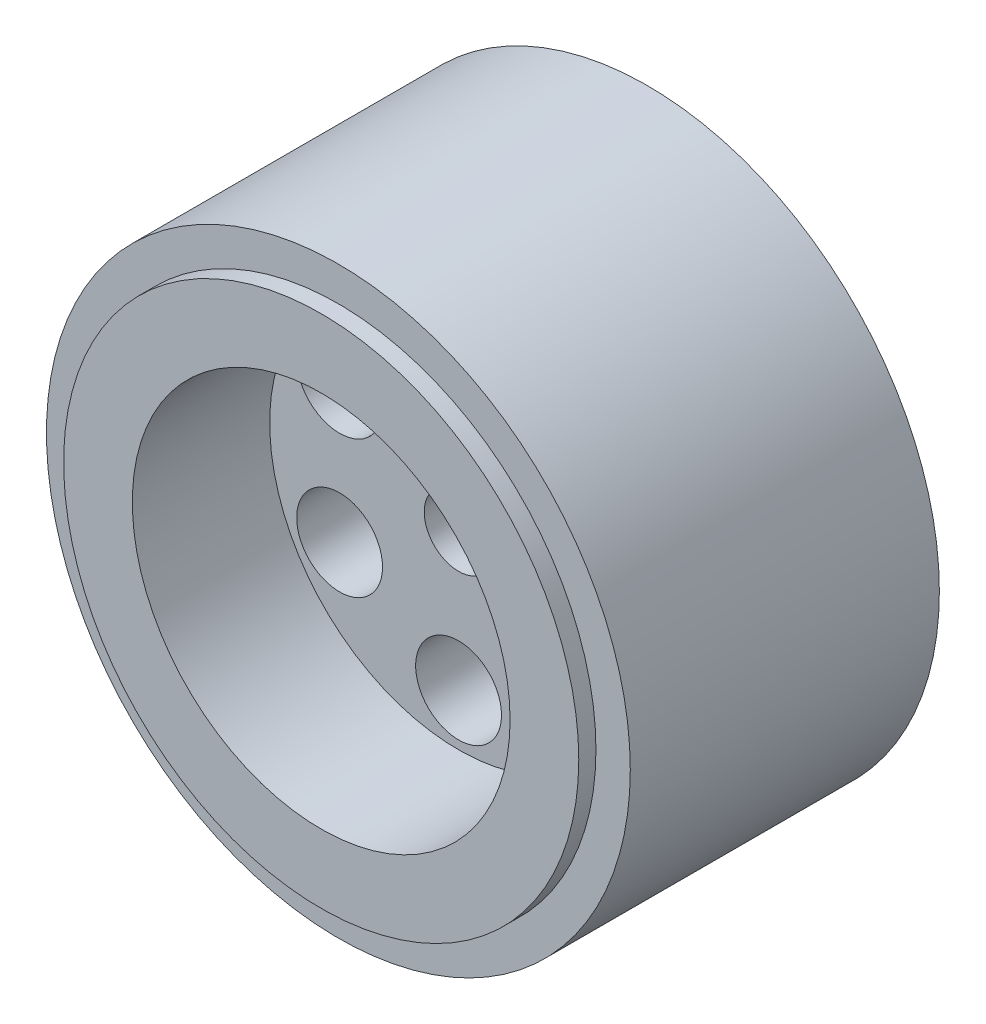
ISO-10303-21;
HEADER;
FILE_DESCRIPTION(('STEP AP214'),'2;1');
FILE_NAME('part.step','',(''),(''),'','','');
FILE_SCHEMA(('AUTOMOTIVE_DESIGN { 1 0 10303 214 1 1 1 1 }'));
ENDSEC;
DATA;
#1=APPLICATION_CONTEXT('core data for automotive mechanical design processes');
#2=APPLICATION_PROTOCOL_DEFINITION('international standard','automotive_design',2000,#1);
#3=PRODUCT_CONTEXT('',#1,'mechanical');
#4=PRODUCT('Part','Part','',(#3));
#5=PRODUCT_RELATED_PRODUCT_CATEGORY('part','',(#4));
#6=PRODUCT_DEFINITION_FORMATION('','',#4);
#7=PRODUCT_DEFINITION_CONTEXT('part definition',#1,'design');
#8=PRODUCT_DEFINITION('design','',#6,#7);
#9=PRODUCT_DEFINITION_SHAPE('','',#8);
#10=(LENGTH_UNIT() NAMED_UNIT(*) SI_UNIT(.MILLI.,.METRE.));
#11=(NAMED_UNIT(*) PLANE_ANGLE_UNIT() SI_UNIT($,.RADIAN.));
#12=(NAMED_UNIT(*) SI_UNIT($,.STERADIAN.) SOLID_ANGLE_UNIT());
#13=UNCERTAINTY_MEASURE_WITH_UNIT(LENGTH_MEASURE(1.E-05),#10,'distance_accuracy_value','');
#14=(GEOMETRIC_REPRESENTATION_CONTEXT(3) GLOBAL_UNCERTAINTY_ASSIGNED_CONTEXT((#13)) GLOBAL_UNIT_ASSIGNED_CONTEXT((#10,
#11,#12)) REPRESENTATION_CONTEXT('',''));
#15=CARTESIAN_POINT('',(0.,0.,0.));
#16=DIRECTION('',(0.,0.,1.));
#17=DIRECTION('',(1.,0.,0.));
#18=AXIS2_PLACEMENT_3D('',#15,#16,#17);
#19=CARTESIAN_POINT('',(0.,28.001,-21.999));
#20=DIRECTION('',(0.,0.,1.));
#21=DIRECTION('',(1.,0.,0.));
#22=AXIS2_PLACEMENT_3D('',#19,#20,#21);
#23=PLANE('',#22);
#24=CARTESIAN_POINT('',(0.,0.,-21.999));
#25=DIRECTION('',(0.,0.,1.));
#26=DIRECTION('',(1.,0.,0.));
#27=AXIS2_PLACEMENT_3D('',#24,#25,#26);
#28=CIRCLE('',#27,34.001);
#29=CARTESIAN_POINT('',(34.001,0.,-21.999));
#30=VERTEX_POINT('',#29);
#31=EDGE_CURVE('E11',#30,#30,#28,.T.);
#32=ORIENTED_EDGE('',*,*,#31,.F.);
#33=EDGE_LOOP('',(#32));
#34=FACE_BOUND('',#33,.T.);
#35=CARTESIAN_POINT('',(0.,0.,-21.999));
#36=DIRECTION('',(0.,0.,1.));
#37=DIRECTION('',(1.,0.,0.));
#38=AXIS2_PLACEMENT_3D('',#35,#36,#37);
#39=CIRCLE('',#38,28.001);
#40=CARTESIAN_POINT('',(28.001,0.,-21.999));
#41=VERTEX_POINT('',#40);
#42=EDGE_CURVE('E55',#41,#41,#39,.T.);
#43=ORIENTED_EDGE('',*,*,#42,.T.);
#44=EDGE_LOOP('',(#43));
#45=FACE_BOUND('',#44,.T.);
#46=ADVANCED_FACE('F41',(#34,#45),#23,.F.);
#47=CARTESIAN_POINT('',(0.,0.,0.));
#48=DIRECTION('',(0.,0.,1.));
#49=DIRECTION('',(1.,0.,0.));
#50=AXIS2_PLACEMENT_3D('',#47,#48,#49);
#51=CYLINDRICAL_SURFACE('',#50,34.001);
#52=CARTESIAN_POINT('',(0.,0.,13.999));
#53=DIRECTION('',(0.,0.,1.));
#54=DIRECTION('',(1.,0.,0.));
#55=AXIS2_PLACEMENT_3D('',#52,#53,#54);
#56=CIRCLE('',#55,34.001);
#57=CARTESIAN_POINT('',(34.001,0.,13.999));
#58=VERTEX_POINT('',#57);
#59=EDGE_CURVE('E47',#58,#58,#56,.T.);
#60=ORIENTED_EDGE('',*,*,#59,.F.);
#61=EDGE_LOOP('',(#60));
#62=FACE_BOUND('',#61,.T.);
#63=ORIENTED_EDGE('',*,*,#31,.T.);
#64=EDGE_LOOP('',(#63));
#65=FACE_BOUND('',#64,.T.);
#66=ADVANCED_FACE('F70',(#62,#65),#51,.T.);
#67=CARTESIAN_POINT('',(0.,34.001,13.999));
#68=DIRECTION('',(0.,0.,-1.));
#69=DIRECTION('',(-1.,0.,0.));
#70=AXIS2_PLACEMENT_3D('',#67,#68,#69);
#71=PLANE('',#70);
#72=CARTESIAN_POINT('',(0.,0.,13.999));
#73=DIRECTION('',(0.,0.,1.));
#74=DIRECTION('',(1.,0.,0.));
#75=AXIS2_PLACEMENT_3D('',#72,#73,#74);
#76=CIRCLE('',#75,28.001);
#77=CARTESIAN_POINT('',(28.001,0.,13.999));
#78=VERTEX_POINT('',#77);
#79=EDGE_CURVE('E51',#78,#78,#76,.T.);
#80=ORIENTED_EDGE('',*,*,#79,.F.);
#81=EDGE_LOOP('',(#80));
#82=FACE_BOUND('',#81,.T.);
#83=ORIENTED_EDGE('',*,*,#59,.T.);
#84=EDGE_LOOP('',(#83));
#85=FACE_BOUND('',#84,.T.);
#86=ADVANCED_FACE('F65',(#82,#85),#71,.F.);
#87=CARTESIAN_POINT('',(0.,0.,0.));
#88=DIRECTION('',(0.,0.,1.));
#89=DIRECTION('',(1.,0.,0.));
#90=AXIS2_PLACEMENT_3D('',#87,#88,#89);
#91=CYLINDRICAL_SURFACE('',#90,28.001);
#92=ORIENTED_EDGE('',*,*,#42,.F.);
#93=EDGE_LOOP('',(#92));
#94=FACE_BOUND('',#93,.T.);
#95=ORIENTED_EDGE('',*,*,#79,.T.);
#96=EDGE_LOOP('',(#95));
#97=FACE_BOUND('',#96,.T.);
#98=ADVANCED_FACE('F62',(#94,#97),#91,.F.);
#99=CLOSED_SHELL('',(#46,#66,#86,#98));
#100=MANIFOLD_SOLID_BREP('B2',#99);
#101=CARTESIAN_POINT('',(0.,22.,-8.));
#102=DIRECTION('',(0.,0.,1.));
#103=DIRECTION('',(1.,0.,0.));
#104=AXIS2_PLACEMENT_3D('',#101,#102,#103);
#105=PLANE('',#104);
#106=CARTESIAN_POINT('',(13.8564064605514,8.00000000000074,-8.));
#107=DIRECTION('',(0.,0.,1.));
#108=DIRECTION('',(1.,0.,0.));
#109=AXIS2_PLACEMENT_3D('',#106,#107,#108);
#110=CIRCLE('',#109,5.);
#111=CARTESIAN_POINT('',(18.8564064605514,8.00000000000074,-8.));
#112=VERTEX_POINT('',#111);
#113=EDGE_CURVE('E153',#112,#112,#110,.F.);
#114=ORIENTED_EDGE('',*,*,#113,.F.);
#115=EDGE_LOOP('',(#114));
#116=FACE_BOUND('',#115,.T.);
#117=CARTESIAN_POINT('',(13.8564064605523,-7.99999999999926,-8.));
#118=DIRECTION('',(0.,0.,1.));
#119=DIRECTION('',(1.,0.,0.));
#120=AXIS2_PLACEMENT_3D('',#117,#118,#119);
#121=CIRCLE('',#120,5.);
#122=CARTESIAN_POINT('',(18.8564064605523,-7.99999999999926,-8.));
#123=VERTEX_POINT('',#122);
#124=EDGE_CURVE('E168',#123,#123,#121,.F.);
#125=ORIENTED_EDGE('',*,*,#124,.F.);
#126=EDGE_LOOP('',(#125));
#127=FACE_BOUND('',#126,.T.);
#128=CARTESIAN_POINT('',(1.70169907897954E-12,-16.,-8.));
#129=DIRECTION('',(0.,0.,1.));
#130=DIRECTION('',(1.,0.,0.));
#131=AXIS2_PLACEMENT_3D('',#128,#129,#130);
#132=CIRCLE('',#131,5.);
#133=CARTESIAN_POINT('',(5.0000000000017,-16.,-8.));
#134=VERTEX_POINT('',#133);
#135=EDGE_CURVE('E162',#134,#134,#132,.F.);
#136=ORIENTED_EDGE('',*,*,#135,.F.);
#137=EDGE_LOOP('',(#136));
#138=FACE_BOUND('',#137,.T.);
#139=CARTESIAN_POINT('',(-13.8564064605506,7.99999999999925,-8.));
#140=DIRECTION('',(0.,0.,1.));
#141=DIRECTION('',(1.,0.,0.));
#142=AXIS2_PLACEMENT_3D('',#139,#140,#141);
#143=CIRCLE('',#142,5.);
#144=CARTESIAN_POINT('',(-8.8564064605506,7.99999999999925,-8.));
#145=VERTEX_POINT('',#144);
#146=EDGE_CURVE('E161',#145,#145,#143,.F.);
#147=ORIENTED_EDGE('',*,*,#146,.F.);
#148=EDGE_LOOP('',(#147));
#149=FACE_BOUND('',#148,.T.);
#150=CARTESIAN_POINT('',(0.,16.,-8.));
#151=DIRECTION('',(0.,0.,1.));
#152=DIRECTION('',(1.,0.,0.));
#153=AXIS2_PLACEMENT_3D('',#150,#151,#152);
#154=CIRCLE('',#153,5.);
#155=CARTESIAN_POINT('',(5.,16.,-8.));
#156=VERTEX_POINT('',#155);
#157=EDGE_CURVE('E147',#156,#156,#154,.F.);
#158=ORIENTED_EDGE('',*,*,#157,.F.);
#159=EDGE_LOOP('',(#158));
#160=FACE_BOUND('',#159,.T.);
#161=CARTESIAN_POINT('',(0.,0.,-8.));
#162=DIRECTION('',(0.,0.,1.));
#163=DIRECTION('',(1.,0.,0.));
#164=AXIS2_PLACEMENT_3D('',#161,#162,#163);
#165=CIRCLE('',#164,22.);
#166=CARTESIAN_POINT('',(22.,0.,-8.));
#167=VERTEX_POINT('',#166);
#168=EDGE_CURVE('E126',#167,#167,#165,.T.);
#169=ORIENTED_EDGE('',*,*,#168,.F.);
#170=EDGE_LOOP('',(#169));
#171=FACE_BOUND('',#170,.T.);
#172=CARTESIAN_POINT('',(0.,0.,-8.));
#173=DIRECTION('',(0.,0.,1.));
#174=DIRECTION('',(1.,0.,0.));
#175=AXIS2_PLACEMENT_3D('',#172,#173,#174);
#176=CIRCLE('',#175,10.);
#177=CARTESIAN_POINT('',(10.,0.,-8.));
#178=VERTEX_POINT('',#177);
#179=EDGE_CURVE('E123',#178,#178,#176,.T.);
#180=ORIENTED_EDGE('',*,*,#179,.T.);
#181=EDGE_LOOP('',(#180));
#182=FACE_BOUND('',#181,.T.);
#183=CARTESIAN_POINT('',(-13.8564064605497,-8.00000000000074,-8.));
#184=DIRECTION('',(0.,0.,1.));
#185=DIRECTION('',(1.,0.,0.));
#186=AXIS2_PLACEMENT_3D('',#183,#184,#185);
#187=CIRCLE('',#186,5.);
#188=CARTESIAN_POINT('',(-8.85640646054974,-8.00000000000074,-8.));
#189=VERTEX_POINT('',#188);
#190=EDGE_CURVE('E154',#189,#189,#187,.F.);
#191=ORIENTED_EDGE('',*,*,#190,.F.);
#192=EDGE_LOOP('',(#191));
#193=FACE_BOUND('',#192,.T.);
#194=ADVANCED_FACE('F103',(#116,#127,#138,#149,#160,#171,#182,#193),#105,.F.);
#195=CARTESIAN_POINT('',(0.,0.,0.));
#196=DIRECTION('',(0.,0.,1.));
#197=DIRECTION('',(1.,0.,0.));
#198=AXIS2_PLACEMENT_3D('',#195,#196,#197);
#199=CYLINDRICAL_SURFACE('',#198,22.);
#200=CARTESIAN_POINT('',(0.,0.,0.));
#201=DIRECTION('',(0.,0.,1.));
#202=DIRECTION('',(1.,0.,0.));
#203=AXIS2_PLACEMENT_3D('',#200,#201,#202);
#204=CIRCLE('',#203,22.);
#205=CARTESIAN_POINT('',(22.,0.,0.));
#206=VERTEX_POINT('',#205);
#207=EDGE_CURVE('E40',#206,#206,#204,.T.);
#208=ORIENTED_EDGE('',*,*,#207,.F.);
#209=EDGE_LOOP('',(#208));
#210=FACE_BOUND('',#209,.T.);
#211=CARTESIAN_POINT('',(0.,0.,16.));
#212=DIRECTION('',(0.,0.,1.));
#213=DIRECTION('',(1.,0.,0.));
#214=AXIS2_PLACEMENT_3D('',#211,#212,#213);
#215=CIRCLE('',#214,22.);
#216=CARTESIAN_POINT('',(22.,0.,16.));
#217=VERTEX_POINT('',#216);
#218=EDGE_CURVE('E144',#217,#217,#215,.T.);
#219=ORIENTED_EDGE('',*,*,#218,.T.);
#220=EDGE_LOOP('',(#219));
#221=FACE_BOUND('',#220,.T.);
#222=ADVANCED_FACE('F105',(#210,#221),#199,.F.);
#223=CARTESIAN_POINT('',(0.,4.,0.));
#224=DIRECTION('',(0.,0.,-1.));
#225=DIRECTION('',(-1.,0.,0.));
#226=AXIS2_PLACEMENT_3D('',#223,#224,#225);
#227=PLANE('',#226);
#228=CARTESIAN_POINT('',(13.8564064605514,8.00000000000074,0.));
#229=DIRECTION('',(0.,0.,1.));
#230=DIRECTION('',(1.,0.,0.));
#231=AXIS2_PLACEMENT_3D('',#228,#229,#230);
#232=CIRCLE('',#231,5.);
#233=CARTESIAN_POINT('',(18.8564064605514,8.00000000000074,0.));
#234=VERTEX_POINT('',#233);
#235=EDGE_CURVE('E171',#234,#234,#232,.T.);
#236=ORIENTED_EDGE('',*,*,#235,.F.);
#237=EDGE_LOOP('',(#236));
#238=FACE_BOUND('',#237,.T.);
#239=CARTESIAN_POINT('',(13.8564064605523,-7.99999999999926,0.));
#240=DIRECTION('',(0.,0.,1.));
#241=DIRECTION('',(1.,0.,0.));
#242=AXIS2_PLACEMENT_3D('',#239,#240,#241);
#243=CIRCLE('',#242,5.);
#244=CARTESIAN_POINT('',(18.8564064605523,-7.99999999999926,0.));
#245=VERTEX_POINT('',#244);
#246=EDGE_CURVE('E165',#245,#245,#243,.T.);
#247=ORIENTED_EDGE('',*,*,#246,.F.);
#248=EDGE_LOOP('',(#247));
#249=FACE_BOUND('',#248,.T.);
#250=CARTESIAN_POINT('',(1.70169907897954E-12,-16.,0.));
#251=DIRECTION('',(0.,0.,1.));
#252=DIRECTION('',(1.,0.,0.));
#253=AXIS2_PLACEMENT_3D('',#250,#251,#252);
#254=CIRCLE('',#253,5.);
#255=CARTESIAN_POINT('',(5.0000000000017,-16.,0.));
#256=VERTEX_POINT('',#255);
#257=EDGE_CURVE('E157',#256,#256,#254,.T.);
#258=ORIENTED_EDGE('',*,*,#257,.F.);
#259=EDGE_LOOP('',(#258));
#260=FACE_BOUND('',#259,.T.);
#261=CARTESIAN_POINT('',(-13.8564064605497,-8.00000000000074,0.));
#262=DIRECTION('',(0.,0.,1.));
#263=DIRECTION('',(1.,0.,0.));
#264=AXIS2_PLACEMENT_3D('',#261,#262,#263);
#265=CIRCLE('',#264,5.);
#266=CARTESIAN_POINT('',(-8.85640646054974,-8.00000000000074,0.));
#267=VERTEX_POINT('',#266);
#268=EDGE_CURVE('E158',#267,#267,#265,.T.);
#269=ORIENTED_EDGE('',*,*,#268,.F.);
#270=EDGE_LOOP('',(#269));
#271=FACE_BOUND('',#270,.T.);
#272=CARTESIAN_POINT('',(-13.8564064605506,7.99999999999925,0.));
#273=DIRECTION('',(0.,0.,1.));
#274=DIRECTION('',(1.,0.,0.));
#275=AXIS2_PLACEMENT_3D('',#272,#273,#274);
#276=CIRCLE('',#275,5.);
#277=CARTESIAN_POINT('',(-8.8564064605506,7.99999999999925,0.));
#278=VERTEX_POINT('',#277);
#279=EDGE_CURVE('E180',#278,#278,#276,.T.);
#280=ORIENTED_EDGE('',*,*,#279,.F.);
#281=EDGE_LOOP('',(#280));
#282=FACE_BOUND('',#281,.T.);
#283=CARTESIAN_POINT('',(0.,16.,0.));
#284=DIRECTION('',(0.,0.,1.));
#285=DIRECTION('',(1.,0.,0.));
#286=AXIS2_PLACEMENT_3D('',#283,#284,#285);
#287=CIRCLE('',#286,5.);
#288=CARTESIAN_POINT('',(5.,16.,0.));
#289=VERTEX_POINT('',#288);
#290=EDGE_CURVE('E150',#289,#289,#287,.T.);
#291=ORIENTED_EDGE('',*,*,#290,.F.);
#292=EDGE_LOOP('',(#291));
#293=FACE_BOUND('',#292,.T.);
#294=CARTESIAN_POINT('',(0.,0.,0.));
#295=DIRECTION('',(0.,0.,1.));
#296=DIRECTION('',(1.,0.,0.));
#297=AXIS2_PLACEMENT_3D('',#294,#295,#296);
#298=CIRCLE('',#297,4.);
#299=CARTESIAN_POINT('',(4.,0.,0.));
#300=VERTEX_POINT('',#299);
#301=EDGE_CURVE('E110',#300,#300,#298,.T.);
#302=ORIENTED_EDGE('',*,*,#301,.F.);
#303=EDGE_LOOP('',(#302));
#304=FACE_BOUND('',#303,.T.);
#305=ORIENTED_EDGE('',*,*,#207,.T.);
#306=EDGE_LOOP('',(#305));
#307=FACE_BOUND('',#306,.T.);
#308=ADVANCED_FACE('F186',(#238,#249,#260,#271,#282,#293,#304,#307),#227,.F.);
#309=CARTESIAN_POINT('',(0.,0.,0.));
#310=DIRECTION('',(0.,0.,1.));
#311=DIRECTION('',(1.,0.,0.));
#312=AXIS2_PLACEMENT_3D('',#309,#310,#311);
#313=CYLINDRICAL_SURFACE('',#312,4.);
#314=CARTESIAN_POINT('',(0.,0.,-22.));
#315=DIRECTION('',(0.,0.,1.));
#316=DIRECTION('',(1.,0.,0.));
#317=AXIS2_PLACEMENT_3D('',#314,#315,#316);
#318=CIRCLE('',#317,4.);
#319=CARTESIAN_POINT('',(4.,0.,-22.));
#320=VERTEX_POINT('',#319);
#321=EDGE_CURVE('E114',#320,#320,#318,.T.);
#322=ORIENTED_EDGE('',*,*,#321,.F.);
#323=EDGE_LOOP('',(#322));
#324=FACE_BOUND('',#323,.T.);
#325=ORIENTED_EDGE('',*,*,#301,.T.);
#326=EDGE_LOOP('',(#325));
#327=FACE_BOUND('',#326,.T.);
#328=ADVANCED_FACE('F189',(#324,#327),#313,.F.);
#329=CARTESIAN_POINT('',(0.,10.,-22.));
#330=DIRECTION('',(0.,0.,1.));
#331=DIRECTION('',(1.,0.,0.));
#332=AXIS2_PLACEMENT_3D('',#329,#330,#331);
#333=PLANE('',#332);
#334=CARTESIAN_POINT('',(0.,0.,-22.));
#335=DIRECTION('',(0.,0.,1.));
#336=DIRECTION('',(1.,0.,0.));
#337=AXIS2_PLACEMENT_3D('',#334,#335,#336);
#338=CIRCLE('',#337,10.);
#339=CARTESIAN_POINT('',(10.,0.,-22.));
#340=VERTEX_POINT('',#339);
#341=EDGE_CURVE('E118',#340,#340,#338,.T.);
#342=ORIENTED_EDGE('',*,*,#341,.F.);
#343=EDGE_LOOP('',(#342));
#344=FACE_BOUND('',#343,.T.);
#345=ORIENTED_EDGE('',*,*,#321,.T.);
#346=EDGE_LOOP('',(#345));
#347=FACE_BOUND('',#346,.T.);
#348=ADVANCED_FACE('F226',(#344,#347),#333,.F.);
#349=CARTESIAN_POINT('',(0.,0.,0.));
#350=DIRECTION('',(0.,0.,1.));
#351=DIRECTION('',(1.,0.,0.));
#352=AXIS2_PLACEMENT_3D('',#349,#350,#351);
#353=CYLINDRICAL_SURFACE('',#352,10.);
#354=ORIENTED_EDGE('',*,*,#179,.F.);
#355=EDGE_LOOP('',(#354));
#356=FACE_BOUND('',#355,.T.);
#357=ORIENTED_EDGE('',*,*,#341,.T.);
#358=EDGE_LOOP('',(#357));
#359=FACE_BOUND('',#358,.T.);
#360=ADVANCED_FACE('F223',(#356,#359),#353,.T.);
#361=CARTESIAN_POINT('',(0.,0.,0.));
#362=DIRECTION('',(0.,0.,1.));
#363=DIRECTION('',(1.,0.,0.));
#364=AXIS2_PLACEMENT_3D('',#361,#362,#363);
#365=CYLINDRICAL_SURFACE('',#364,22.);
#366=CARTESIAN_POINT('',(0.,0.,-22.));
#367=DIRECTION('',(0.,0.,1.));
#368=DIRECTION('',(1.,0.,0.));
#369=AXIS2_PLACEMENT_3D('',#366,#367,#368);
#370=CIRCLE('',#369,22.);
#371=CARTESIAN_POINT('',(22.,0.,-22.));
#372=VERTEX_POINT('',#371);
#373=EDGE_CURVE('E129',#372,#372,#370,.T.);
#374=ORIENTED_EDGE('',*,*,#373,.F.);
#375=EDGE_LOOP('',(#374));
#376=FACE_BOUND('',#375,.T.);
#377=ORIENTED_EDGE('',*,*,#168,.T.);
#378=EDGE_LOOP('',(#377));
#379=FACE_BOUND('',#378,.T.);
#380=ADVANCED_FACE('F221',(#376,#379),#365,.F.);
#381=CARTESIAN_POINT('',(0.,28.,-22.));
#382=DIRECTION('',(0.,0.,1.));
#383=DIRECTION('',(1.,0.,0.));
#384=AXIS2_PLACEMENT_3D('',#381,#382,#383);
#385=PLANE('',#384);
#386=CARTESIAN_POINT('',(0.,0.,-22.));
#387=DIRECTION('',(0.,0.,1.));
#388=DIRECTION('',(1.,0.,0.));
#389=AXIS2_PLACEMENT_3D('',#386,#387,#388);
#390=CIRCLE('',#389,28.);
#391=CARTESIAN_POINT('',(28.,0.,-22.));
#392=VERTEX_POINT('',#391);
#393=EDGE_CURVE('E132',#392,#392,#390,.T.);
#394=ORIENTED_EDGE('',*,*,#393,.F.);
#395=EDGE_LOOP('',(#394));
#396=FACE_BOUND('',#395,.T.);
#397=ORIENTED_EDGE('',*,*,#373,.T.);
#398=EDGE_LOOP('',(#397));
#399=FACE_BOUND('',#398,.T.);
#400=ADVANCED_FACE('F254',(#396,#399),#385,.F.);
#401=CARTESIAN_POINT('',(0.,0.,0.));
#402=DIRECTION('',(0.,0.,1.));
#403=DIRECTION('',(1.,0.,0.));
#404=AXIS2_PLACEMENT_3D('',#401,#402,#403);
#405=CYLINDRICAL_SURFACE('',#404,28.);
#406=CARTESIAN_POINT('',(0.,0.,14.));
#407=DIRECTION('',(0.,0.,1.));
#408=DIRECTION('',(1.,0.,0.));
#409=AXIS2_PLACEMENT_3D('',#406,#407,#408);
#410=CIRCLE('',#409,28.);
#411=CARTESIAN_POINT('',(28.,0.,14.));
#412=VERTEX_POINT('',#411);
#413=EDGE_CURVE('E135',#412,#412,#410,.T.);
#414=ORIENTED_EDGE('',*,*,#413,.F.);
#415=EDGE_LOOP('',(#414));
#416=FACE_BOUND('',#415,.T.);
#417=ORIENTED_EDGE('',*,*,#393,.T.);
#418=EDGE_LOOP('',(#417));
#419=FACE_BOUND('',#418,.T.);
#420=ADVANCED_FACE('F262',(#416,#419),#405,.T.);
#421=CARTESIAN_POINT('',(0.,30.,14.));
#422=DIRECTION('',(0.,0.,1.));
#423=DIRECTION('',(1.,0.,0.));
#424=AXIS2_PLACEMENT_3D('',#421,#422,#423);
#425=PLANE('',#424);
#426=CARTESIAN_POINT('',(0.,0.,14.));
#427=DIRECTION('',(0.,0.,1.));
#428=DIRECTION('',(1.,0.,0.));
#429=AXIS2_PLACEMENT_3D('',#426,#427,#428);
#430=CIRCLE('',#429,30.);
#431=CARTESIAN_POINT('',(30.,0.,14.));
#432=VERTEX_POINT('',#431);
#433=EDGE_CURVE('E138',#432,#432,#430,.T.);
#434=ORIENTED_EDGE('',*,*,#433,.F.);
#435=EDGE_LOOP('',(#434));
#436=FACE_BOUND('',#435,.T.);
#437=ORIENTED_EDGE('',*,*,#413,.T.);
#438=EDGE_LOOP('',(#437));
#439=FACE_BOUND('',#438,.T.);
#440=ADVANCED_FACE('F269',(#436,#439),#425,.F.);
#441=CARTESIAN_POINT('',(0.,0.,0.));
#442=DIRECTION('',(0.,0.,1.));
#443=DIRECTION('',(1.,0.,0.));
#444=AXIS2_PLACEMENT_3D('',#441,#442,#443);
#445=CYLINDRICAL_SURFACE('',#444,30.);
#446=CARTESIAN_POINT('',(0.,0.,16.));
#447=DIRECTION('',(0.,0.,1.));
#448=DIRECTION('',(1.,0.,0.));
#449=AXIS2_PLACEMENT_3D('',#446,#447,#448);
#450=CIRCLE('',#449,30.);
#451=CARTESIAN_POINT('',(30.,0.,16.));
#452=VERTEX_POINT('',#451);
#453=EDGE_CURVE('E141',#452,#452,#450,.T.);
#454=ORIENTED_EDGE('',*,*,#453,.F.);
#455=EDGE_LOOP('',(#454));
#456=FACE_BOUND('',#455,.T.);
#457=ORIENTED_EDGE('',*,*,#433,.T.);
#458=EDGE_LOOP('',(#457));
#459=FACE_BOUND('',#458,.T.);
#460=ADVANCED_FACE('F206',(#456,#459),#445,.T.);
#461=CARTESIAN_POINT('',(0.,22.,16.));
#462=DIRECTION('',(0.,0.,-1.));
#463=DIRECTION('',(-1.,0.,0.));
#464=AXIS2_PLACEMENT_3D('',#461,#462,#463);
#465=PLANE('',#464);
#466=ORIENTED_EDGE('',*,*,#218,.F.);
#467=EDGE_LOOP('',(#466));
#468=FACE_BOUND('',#467,.T.);
#469=ORIENTED_EDGE('',*,*,#453,.T.);
#470=EDGE_LOOP('',(#469));
#471=FACE_BOUND('',#470,.T.);
#472=ADVANCED_FACE('F196',(#468,#471),#465,.F.);
#473=CARTESIAN_POINT('',(0.,16.,-22.142135623731));
#474=DIRECTION('',(0.,0.,1.));
#475=DIRECTION('',(1.,0.,0.));
#476=AXIS2_PLACEMENT_3D('',#473,#474,#475);
#477=CYLINDRICAL_SURFACE('',#476,5.);
#478=ORIENTED_EDGE('',*,*,#157,.T.);
#479=EDGE_LOOP('',(#478));
#480=FACE_BOUND('',#479,.T.);
#481=ORIENTED_EDGE('',*,*,#290,.T.);
#482=EDGE_LOOP('',(#481));
#483=FACE_BOUND('',#482,.T.);
#484=ADVANCED_FACE('F194',(#480,#483),#477,.F.);
#485=CARTESIAN_POINT('',(-13.8564064605506,7.99999999999925,-22.142135623731));
#486=DIRECTION('',(0.,0.,1.));
#487=DIRECTION('',(1.,0.,0.));
#488=AXIS2_PLACEMENT_3D('',#485,#486,#487);
#489=CYLINDRICAL_SURFACE('',#488,5.);
#490=ORIENTED_EDGE('',*,*,#146,.T.);
#491=EDGE_LOOP('',(#490));
#492=FACE_BOUND('',#491,.T.);
#493=ORIENTED_EDGE('',*,*,#279,.T.);
#494=EDGE_LOOP('',(#493));
#495=FACE_BOUND('',#494,.T.);
#496=ADVANCED_FACE('F184',(#492,#495),#489,.F.);
#497=CARTESIAN_POINT('',(1.70169907897954E-12,-16.,-22.142135623731));
#498=DIRECTION('',(0.,0.,1.));
#499=DIRECTION('',(1.,0.,0.));
#500=AXIS2_PLACEMENT_3D('',#497,#498,#499);
#501=CYLINDRICAL_SURFACE('',#500,5.);
#502=ORIENTED_EDGE('',*,*,#135,.T.);
#503=EDGE_LOOP('',(#502));
#504=FACE_BOUND('',#503,.T.);
#505=ORIENTED_EDGE('',*,*,#257,.T.);
#506=EDGE_LOOP('',(#505));
#507=FACE_BOUND('',#506,.T.);
#508=ADVANCED_FACE('F203',(#504,#507),#501,.F.);
#509=CARTESIAN_POINT('',(13.8564064605523,-7.99999999999926,-22.142135623731));
#510=DIRECTION('',(0.,0.,1.));
#511=DIRECTION('',(1.,0.,0.));
#512=AXIS2_PLACEMENT_3D('',#509,#510,#511);
#513=CYLINDRICAL_SURFACE('',#512,5.);
#514=ORIENTED_EDGE('',*,*,#124,.T.);
#515=EDGE_LOOP('',(#514));
#516=FACE_BOUND('',#515,.T.);
#517=ORIENTED_EDGE('',*,*,#246,.T.);
#518=EDGE_LOOP('',(#517));
#519=FACE_BOUND('',#518,.T.);
#520=ADVANCED_FACE('F352',(#516,#519),#513,.F.);
#521=CARTESIAN_POINT('',(13.8564064605514,8.00000000000074,-22.142135623731));
#522=DIRECTION('',(0.,0.,1.));
#523=DIRECTION('',(1.,0.,0.));
#524=AXIS2_PLACEMENT_3D('',#521,#522,#523);
#525=CYLINDRICAL_SURFACE('',#524,5.);
#526=ORIENTED_EDGE('',*,*,#113,.T.);
#527=EDGE_LOOP('',(#526));
#528=FACE_BOUND('',#527,.T.);
#529=ORIENTED_EDGE('',*,*,#235,.T.);
#530=EDGE_LOOP('',(#529));
#531=FACE_BOUND('',#530,.T.);
#532=ADVANCED_FACE('F362',(#528,#531),#525,.F.);
#533=CARTESIAN_POINT('',(-13.8564064605497,-8.00000000000074,-22.142135623731));
#534=DIRECTION('',(0.,0.,1.));
#535=DIRECTION('',(1.,0.,0.));
#536=AXIS2_PLACEMENT_3D('',#533,#534,#535);
#537=CYLINDRICAL_SURFACE('',#536,5.);
#538=ORIENTED_EDGE('',*,*,#190,.T.);
#539=EDGE_LOOP('',(#538));
#540=FACE_BOUND('',#539,.T.);
#541=ORIENTED_EDGE('',*,*,#268,.T.);
#542=EDGE_LOOP('',(#541));
#543=FACE_BOUND('',#542,.T.);
#544=ADVANCED_FACE('F372',(#540,#543),#537,.F.);
#545=CLOSED_SHELL('',(#194,#222,#308,#328,#348,#360,#380,#400,#420,#440,#460,#472,#484,#496,
#508,#520,#532,#544));
#546=MANIFOLD_SOLID_BREP('B6',#545);
#547=ADVANCED_BREP_SHAPE_REPRESENTATION('',(#18,#100,#546),#14);
#548=SHAPE_DEFINITION_REPRESENTATION(#9,#547);
ENDSEC;
END-ISO-10303-21;
